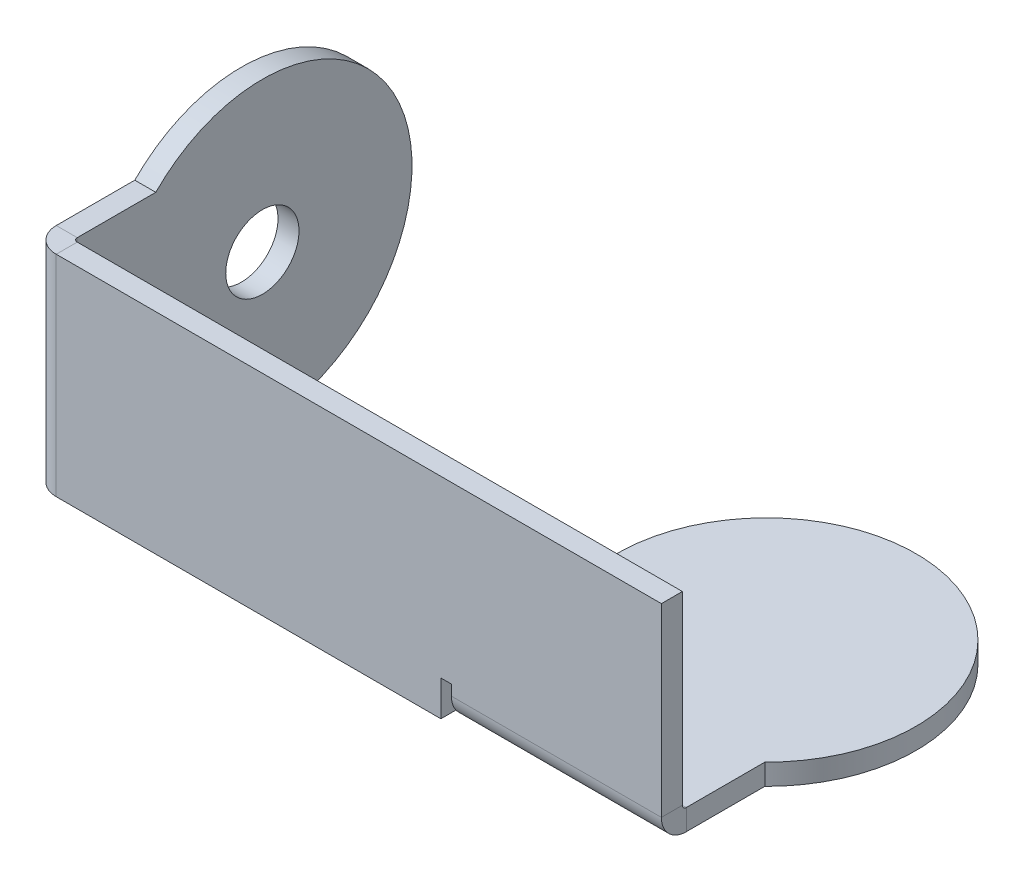
ISO-10303-21;
HEADER;
FILE_DESCRIPTION(('STEP AP214'),'2;1');
FILE_NAME('part.step','',(''),(''),'','','');
FILE_SCHEMA(('AUTOMOTIVE_DESIGN { 1 0 10303 214 1 1 1 1 }'));
ENDSEC;
DATA;
#1=APPLICATION_CONTEXT('core data for automotive mechanical design processes');
#2=APPLICATION_PROTOCOL_DEFINITION('international standard','automotive_design',2000,#1);
#3=PRODUCT_CONTEXT('',#1,'mechanical');
#4=PRODUCT('Part','Part','',(#3));
#5=PRODUCT_RELATED_PRODUCT_CATEGORY('part','',(#4));
#6=PRODUCT_DEFINITION_FORMATION('','',#4);
#7=PRODUCT_DEFINITION_CONTEXT('part definition',#1,'design');
#8=PRODUCT_DEFINITION('design','',#6,#7);
#9=PRODUCT_DEFINITION_SHAPE('','',#8);
#10=(LENGTH_UNIT() NAMED_UNIT(*) SI_UNIT(.MILLI.,.METRE.));
#11=(NAMED_UNIT(*) PLANE_ANGLE_UNIT() SI_UNIT($,.RADIAN.));
#12=(NAMED_UNIT(*) SI_UNIT($,.STERADIAN.) SOLID_ANGLE_UNIT());
#13=UNCERTAINTY_MEASURE_WITH_UNIT(LENGTH_MEASURE(1.E-05),#10,'distance_accuracy_value','');
#14=(GEOMETRIC_REPRESENTATION_CONTEXT(3) GLOBAL_UNCERTAINTY_ASSIGNED_CONTEXT((#13)) GLOBAL_UNIT_ASSIGNED_CONTEXT((#10,
#11,#12)) REPRESENTATION_CONTEXT('',''));
#15=CARTESIAN_POINT('',(0.,0.,0.));
#16=DIRECTION('',(0.,0.,1.));
#17=DIRECTION('',(1.,0.,0.));
#18=AXIS2_PLACEMENT_3D('',#15,#16,#17);
#19=CARTESIAN_POINT('',(0.,0.,-4.));
#20=DIRECTION('',(0.,0.,-1.));
#21=DIRECTION('',(-1.,0.,0.));
#22=AXIS2_PLACEMENT_3D('',#19,#20,#21);
#23=PLANE('',#22);
#24=DIRECTION('',(1.,0.,0.));
#25=VECTOR('',#24,1.);
#26=CARTESIAN_POINT('',(18.,-13.2634,-4.));
#27=LINE('',#26,#25);
#28=CARTESIAN_POINT('',(18.,-13.2634,-4.));
#29=VERTEX_POINT('',#28);
#30=CARTESIAN_POINT('',(20.,-13.2634,-4.));
#31=VERTEX_POINT('',#30);
#32=EDGE_CURVE('E254',#29,#31,#27,.T.);
#33=ORIENTED_EDGE('',*,*,#32,.F.);
#34=DIRECTION('',(0.,1.,0.));
#35=VECTOR('',#34,1.);
#36=CARTESIAN_POINT('',(18.,-20.,-4.));
#37=LINE('',#36,#35);
#38=CARTESIAN_POINT('',(18.,-20.,-4.));
#39=VERTEX_POINT('',#38);
#40=EDGE_CURVE('E249',#39,#29,#37,.T.);
#41=ORIENTED_EDGE('',*,*,#40,.F.);
#42=DIRECTION('',(1.,0.,0.));
#43=VECTOR('',#42,1.);
#44=CARTESIAN_POINT('',(60.,-20.,-4.));
#45=LINE('',#44,#43);
#46=CARTESIAN_POINT('',(-55.2634,-20.,-4.));
#47=VERTEX_POINT('',#46);
#48=EDGE_CURVE('E329',#47,#39,#45,.T.);
#49=ORIENTED_EDGE('',*,*,#48,.F.);
#50=DIRECTION('',(0.,1.,0.));
#51=VECTOR('',#50,1.);
#52=CARTESIAN_POINT('',(-55.2634,20.,-3.99999999999999));
#53=LINE('',#52,#51);
#54=CARTESIAN_POINT('',(-55.2634,20.,-4.));
#55=VERTEX_POINT('',#54);
#56=EDGE_CURVE('E319',#55,#47,#53,.F.);
#57=ORIENTED_EDGE('',*,*,#56,.F.);
#58=DIRECTION('',(-1.,0.,0.));
#59=VECTOR('',#58,1.);
#60=CARTESIAN_POINT('',(60.,20.,-4.));
#61=LINE('',#60,#59);
#62=CARTESIAN_POINT('',(60.,20.,-4.));
#63=VERTEX_POINT('',#62);
#64=EDGE_CURVE('E335',#63,#55,#61,.T.);
#65=ORIENTED_EDGE('',*,*,#64,.F.);
#66=DIRECTION('',(0.,1.,0.));
#67=VECTOR('',#66,1.);
#68=CARTESIAN_POINT('',(60.,20.,-4.));
#69=LINE('',#68,#67);
#70=CARTESIAN_POINT('',(60.,-15.2634,-4.));
#71=VERTEX_POINT('',#70);
#72=EDGE_CURVE('E332',#71,#63,#69,.T.);
#73=ORIENTED_EDGE('',*,*,#72,.F.);
#74=DIRECTION('',(-1.,0.,0.));
#75=VECTOR('',#74,1.);
#76=CARTESIAN_POINT('',(20.,-15.2634,-4.));
#77=LINE('',#76,#75);
#78=CARTESIAN_POINT('',(20.,-15.2634,-4.));
#79=VERTEX_POINT('',#78);
#80=EDGE_CURVE('E239',#79,#71,#77,.F.);
#81=ORIENTED_EDGE('',*,*,#80,.F.);
#82=DIRECTION('',(0.,-1.,0.));
#83=VECTOR('',#82,1.);
#84=CARTESIAN_POINT('',(20.,-13.2634,-4.));
#85=LINE('',#84,#83);
#86=EDGE_CURVE('E258',#31,#79,#85,.T.);
#87=ORIENTED_EDGE('',*,*,#86,.F.);
#88=EDGE_LOOP('',(#33,#41,#49,#57,#65,#73,#81,#87));
#89=FACE_BOUND('',#88,.T.);
#90=ADVANCED_FACE('F81',(#89),#23,.T.);
#91=CARTESIAN_POINT('',(0.,0.,0.));
#92=DIRECTION('',(0.,0.,-1.));
#93=DIRECTION('',(-1.,0.,0.));
#94=AXIS2_PLACEMENT_3D('',#91,#92,#93);
#95=PLANE('',#94);
#96=DIRECTION('',(0.,-1.,0.));
#97=VECTOR('',#96,1.);
#98=CARTESIAN_POINT('',(18.,0.,0.));
#99=LINE('',#98,#97);
#100=CARTESIAN_POINT('',(18.,-13.2634,0.));
#101=VERTEX_POINT('',#100);
#102=CARTESIAN_POINT('',(18.,-20.,0.));
#103=VERTEX_POINT('',#102);
#104=EDGE_CURVE('E252',#101,#103,#99,.T.);
#105=ORIENTED_EDGE('',*,*,#104,.F.);
#106=DIRECTION('',(-1.,0.,0.));
#107=VECTOR('',#106,1.);
#108=CARTESIAN_POINT('',(0.,-13.2634,0.));
#109=LINE('',#108,#107);
#110=CARTESIAN_POINT('',(20.,-13.2634,0.));
#111=VERTEX_POINT('',#110);
#112=EDGE_CURVE('E13',#111,#101,#109,.T.);
#113=ORIENTED_EDGE('',*,*,#112,.F.);
#114=DIRECTION('',(0.,1.,0.));
#115=VECTOR('',#114,1.);
#116=CARTESIAN_POINT('',(20.,0.,0.));
#117=LINE('',#116,#115);
#118=CARTESIAN_POINT('',(20.,-15.2634,0.));
#119=VERTEX_POINT('',#118);
#120=EDGE_CURVE('E89',#119,#111,#117,.T.);
#121=ORIENTED_EDGE('',*,*,#120,.F.);
#122=DIRECTION('',(-1.,0.,0.));
#123=VECTOR('',#122,1.);
#124=CARTESIAN_POINT('',(20.,-15.2634,0.));
#125=LINE('',#124,#123);
#126=CARTESIAN_POINT('',(60.,-15.2634,0.));
#127=VERTEX_POINT('',#126);
#128=EDGE_CURVE('E211',#119,#127,#125,.F.);
#129=ORIENTED_EDGE('',*,*,#128,.T.);
#130=DIRECTION('',(0.,1.,0.));
#131=VECTOR('',#130,1.);
#132=CARTESIAN_POINT('',(60.,20.,0.));
#133=LINE('',#132,#131);
#134=CARTESIAN_POINT('',(60.,20.,0.));
#135=VERTEX_POINT('',#134);
#136=EDGE_CURVE('E341',#127,#135,#133,.T.);
#137=ORIENTED_EDGE('',*,*,#136,.T.);
#138=DIRECTION('',(-1.,0.,0.));
#139=VECTOR('',#138,1.);
#140=CARTESIAN_POINT('',(60.,20.,0.));
#141=LINE('',#140,#139);
#142=CARTESIAN_POINT('',(-55.2634,20.,0.));
#143=VERTEX_POINT('',#142);
#144=EDGE_CURVE('E333',#135,#143,#141,.T.);
#145=ORIENTED_EDGE('',*,*,#144,.T.);
#146=DIRECTION('',(0.,1.,0.));
#147=VECTOR('',#146,1.);
#148=CARTESIAN_POINT('',(-55.2634,20.,0.));
#149=LINE('',#148,#147);
#150=CARTESIAN_POINT('',(-55.2634,-20.,0.));
#151=VERTEX_POINT('',#150);
#152=EDGE_CURVE('E307',#143,#151,#149,.F.);
#153=ORIENTED_EDGE('',*,*,#152,.T.);
#154=DIRECTION('',(1.,0.,0.));
#155=VECTOR('',#154,1.);
#156=CARTESIAN_POINT('',(60.,-20.,0.));
#157=LINE('',#156,#155);
#158=EDGE_CURVE('E327',#151,#103,#157,.T.);
#159=ORIENTED_EDGE('',*,*,#158,.T.);
#160=EDGE_LOOP('',(#105,#113,#121,#129,#137,#145,#153,#159));
#161=FACE_BOUND('',#160,.T.);
#162=ADVANCED_FACE('F355',(#161),#95,.F.);
#163=CARTESIAN_POINT('',(60.,-20.,-4.));
#164=DIRECTION('',(0.,-1.,0.));
#165=DIRECTION('',(1.,0.,0.));
#166=AXIS2_PLACEMENT_3D('',#163,#164,#165);
#167=PLANE('',#166);
#168=ORIENTED_EDGE('',*,*,#48,.T.);
#169=DIRECTION('',(0.,0.,1.));
#170=VECTOR('',#169,1.);
#171=CARTESIAN_POINT('',(18.,-20.,-4.));
#172=LINE('',#171,#170);
#173=EDGE_CURVE('E253',#39,#103,#172,.T.);
#174=ORIENTED_EDGE('',*,*,#173,.T.);
#175=ORIENTED_EDGE('',*,*,#158,.F.);
#176=DIRECTION('',(0.,0.,1.));
#177=VECTOR('',#176,1.);
#178=CARTESIAN_POINT('',(-55.2634,-20.,-3.99999999999999));
#179=LINE('',#178,#177);
#180=EDGE_CURVE('E324',#47,#151,#179,.T.);
#181=ORIENTED_EDGE('',*,*,#180,.F.);
#182=EDGE_LOOP('',(#168,#174,#175,#181));
#183=FACE_BOUND('',#182,.T.);
#184=ADVANCED_FACE('F83',(#183),#167,.T.);
#185=CARTESIAN_POINT('',(60.,20.,-4.));
#186=DIRECTION('',(0.,1.,0.));
#187=DIRECTION('',(-1.,0.,0.));
#188=AXIS2_PLACEMENT_3D('',#185,#186,#187);
#189=PLANE('',#188);
#190=ORIENTED_EDGE('',*,*,#64,.T.);
#191=DIRECTION('',(0.,0.,1.));
#192=VECTOR('',#191,1.);
#193=CARTESIAN_POINT('',(-55.2634,20.,-3.99999999999999));
#194=LINE('',#193,#192);
#195=EDGE_CURVE('E313',#55,#143,#194,.T.);
#196=ORIENTED_EDGE('',*,*,#195,.T.);
#197=ORIENTED_EDGE('',*,*,#144,.F.);
#198=DIRECTION('',(0.,0.,1.));
#199=VECTOR('',#198,1.);
#200=CARTESIAN_POINT('',(60.,20.,-4.));
#201=LINE('',#200,#199);
#202=EDGE_CURVE('E338',#63,#135,#201,.T.);
#203=ORIENTED_EDGE('',*,*,#202,.F.);
#204=EDGE_LOOP('',(#190,#196,#197,#203));
#205=FACE_BOUND('',#204,.T.);
#206=ADVANCED_FACE('F399',(#205),#189,.T.);
#207=CARTESIAN_POINT('',(60.,20.,-4.));
#208=DIRECTION('',(1.,0.,0.));
#209=DIRECTION('',(0.,1.,0.));
#210=AXIS2_PLACEMENT_3D('',#207,#208,#209);
#211=PLANE('',#210);
#212=DIRECTION('',(0.,0.,1.));
#213=VECTOR('',#212,1.);
#214=CARTESIAN_POINT('',(60.,-15.2634,-4.));
#215=LINE('',#214,#213);
#216=EDGE_CURVE('E243',#71,#127,#215,.T.);
#217=ORIENTED_EDGE('',*,*,#216,.F.);
#218=ORIENTED_EDGE('',*,*,#72,.T.);
#219=ORIENTED_EDGE('',*,*,#202,.T.);
#220=ORIENTED_EDGE('',*,*,#136,.F.);
#221=EDGE_LOOP('',(#217,#218,#219,#220));
#222=FACE_BOUND('',#221,.T.);
#223=ADVANCED_FACE('F443',(#222),#211,.T.);
#224=CARTESIAN_POINT('',(-55.2634,-20.,-4.7366));
#225=DIRECTION('',(0.,-1.,0.));
#226=DIRECTION('',(0.,0.,-1.));
#227=AXIS2_PLACEMENT_3D('',#224,#225,#226);
#228=PLANE('',#227);
#229=DIRECTION('',(-1.,0.,0.));
#230=VECTOR('',#229,1.);
#231=CARTESIAN_POINT('',(-60.,-20.,-4.73659999999998));
#232=LINE('',#231,#230);
#233=CARTESIAN_POINT('',(-56.,-20.,-4.73659999999999));
#234=VERTEX_POINT('',#233);
#235=CARTESIAN_POINT('',(-60.,-20.,-4.73659999999998));
#236=VERTEX_POINT('',#235);
#237=EDGE_CURVE('E285',#234,#236,#232,.T.);
#238=ORIENTED_EDGE('',*,*,#237,.F.);
#239=CARTESIAN_POINT('',(-55.2634,-20.,-4.7366));
#240=DIRECTION('',(0.,1.,0.));
#241=DIRECTION('',(0.,0.,1.));
#242=AXIS2_PLACEMENT_3D('',#239,#240,#241);
#243=CIRCLE('',#242,0.736600000000004);
#244=EDGE_CURVE('E316',#47,#234,#243,.F.);
#245=ORIENTED_EDGE('',*,*,#244,.F.);
#246=ORIENTED_EDGE('',*,*,#180,.T.);
#247=CARTESIAN_POINT('',(-55.2634,-20.,-4.7366));
#248=DIRECTION('',(0.,1.,0.));
#249=DIRECTION('',(0.,0.,1.));
#250=AXIS2_PLACEMENT_3D('',#247,#248,#249);
#251=CIRCLE('',#250,4.7366);
#252=EDGE_CURVE('E309',#151,#236,#251,.F.);
#253=ORIENTED_EDGE('',*,*,#252,.T.);
#254=EDGE_LOOP('',(#238,#245,#246,#253));
#255=FACE_BOUND('',#254,.T.);
#256=ADVANCED_FACE('F370',(#255),#228,.T.);
#257=CARTESIAN_POINT('',(-55.2634,20.,-4.7366));
#258=DIRECTION('',(0.,-1.,0.));
#259=DIRECTION('',(0.,0.,-1.));
#260=AXIS2_PLACEMENT_3D('',#257,#258,#259);
#261=PLANE('',#260);
#262=CARTESIAN_POINT('',(-55.2634,20.,-4.7366));
#263=DIRECTION('',(0.,1.,0.));
#264=DIRECTION('',(0.,0.,1.));
#265=AXIS2_PLACEMENT_3D('',#262,#263,#264);
#266=CIRCLE('',#265,0.736600000000004);
#267=CARTESIAN_POINT('',(-56.,20.,-4.73659999999999));
#268=VERTEX_POINT('',#267);
#269=EDGE_CURVE('E288',#268,#55,#266,.T.);
#270=ORIENTED_EDGE('',*,*,#269,.F.);
#271=DIRECTION('',(-1.,0.,0.));
#272=VECTOR('',#271,1.);
#273=CARTESIAN_POINT('',(-56.,20.,-4.73659999999999));
#274=LINE('',#273,#272);
#275=CARTESIAN_POINT('',(-60.,20.,-4.73659999999998));
#276=VERTEX_POINT('',#275);
#277=EDGE_CURVE('E299',#268,#276,#274,.T.);
#278=ORIENTED_EDGE('',*,*,#277,.T.);
#279=CARTESIAN_POINT('',(-55.2634,20.,-4.7366));
#280=DIRECTION('',(0.,1.,0.));
#281=DIRECTION('',(0.,0.,1.));
#282=AXIS2_PLACEMENT_3D('',#279,#280,#281);
#283=CIRCLE('',#282,4.7366);
#284=EDGE_CURVE('E310',#276,#143,#283,.T.);
#285=ORIENTED_EDGE('',*,*,#284,.T.);
#286=ORIENTED_EDGE('',*,*,#195,.F.);
#287=EDGE_LOOP('',(#270,#278,#285,#286));
#288=FACE_BOUND('',#287,.T.);
#289=ADVANCED_FACE('F388',(#288),#261,.F.);
#290=CARTESIAN_POINT('',(-55.2634,20.,-4.7366));
#291=DIRECTION('',(0.,1.,0.));
#292=DIRECTION('',(-1.,0.,0.));
#293=AXIS2_PLACEMENT_3D('',#290,#291,#292);
#294=CYLINDRICAL_SURFACE('',#293,4.7366);
#295=ORIENTED_EDGE('',*,*,#152,.F.);
#296=ORIENTED_EDGE('',*,*,#284,.F.);
#297=DIRECTION('',(0.,1.,0.));
#298=VECTOR('',#297,1.);
#299=CARTESIAN_POINT('',(-60.,0.,-4.73659999999998));
#300=LINE('',#299,#298);
#301=EDGE_CURVE('E296',#236,#276,#300,.T.);
#302=ORIENTED_EDGE('',*,*,#301,.F.);
#303=ORIENTED_EDGE('',*,*,#252,.F.);
#304=EDGE_LOOP('',(#295,#296,#302,#303));
#305=FACE_BOUND('',#304,.T.);
#306=ADVANCED_FACE('F394',(#305),#294,.T.);
#307=CARTESIAN_POINT('',(-55.2634,20.,-4.7366));
#308=DIRECTION('',(0.,1.,0.));
#309=DIRECTION('',(-1.,0.,0.));
#310=AXIS2_PLACEMENT_3D('',#307,#308,#309);
#311=CYLINDRICAL_SURFACE('',#310,0.736600000000004);
#312=ORIENTED_EDGE('',*,*,#56,.T.);
#313=ORIENTED_EDGE('',*,*,#244,.T.);
#314=DIRECTION('',(0.,-1.,0.));
#315=VECTOR('',#314,1.);
#316=CARTESIAN_POINT('',(-56.,-20.,-4.73659999999999));
#317=LINE('',#316,#315);
#318=EDGE_CURVE('E302',#234,#268,#317,.F.);
#319=ORIENTED_EDGE('',*,*,#318,.T.);
#320=ORIENTED_EDGE('',*,*,#269,.T.);
#321=EDGE_LOOP('',(#312,#313,#319,#320));
#322=FACE_BOUND('',#321,.T.);
#323=ADVANCED_FACE('F366',(#322),#311,.F.);
#324=CARTESIAN_POINT('',(-60.,20.,-3.99999999999999));
#325=DIRECTION('',(0.,1.,0.));
#326=DIRECTION('',(0.,0.,1.));
#327=AXIS2_PLACEMENT_3D('',#324,#325,#326);
#328=PLANE('',#327);
#329=DIRECTION('',(-1.,0.,0.));
#330=VECTOR('',#329,1.);
#331=CARTESIAN_POINT('',(-56.,20.,-19.6960594957529));
#332=LINE('',#331,#330);
#333=CARTESIAN_POINT('',(-60.0000000000001,20.,-19.6960594957528));
#334=VERTEX_POINT('',#333);
#335=CARTESIAN_POINT('',(-56.0000000000001,20.,-19.6960594957529));
#336=VERTEX_POINT('',#335);
#337=EDGE_CURVE('E282',#334,#336,#332,.F.);
#338=ORIENTED_EDGE('',*,*,#337,.F.);
#339=DIRECTION('',(0.,0.,1.));
#340=VECTOR('',#339,1.);
#341=CARTESIAN_POINT('',(-60.,20.,-3.99999999999999));
#342=LINE('',#341,#340);
#343=EDGE_CURVE('E286',#334,#276,#342,.T.);
#344=ORIENTED_EDGE('',*,*,#343,.T.);
#345=ORIENTED_EDGE('',*,*,#277,.F.);
#346=DIRECTION('',(0.,0.,-1.));
#347=VECTOR('',#346,1.);
#348=CARTESIAN_POINT('',(-56.,20.,2.08166817117217E-13));
#349=LINE('',#348,#347);
#350=EDGE_CURVE('E291',#336,#268,#349,.F.);
#351=ORIENTED_EDGE('',*,*,#350,.F.);
#352=EDGE_LOOP('',(#338,#344,#345,#351));
#353=FACE_BOUND('',#352,.T.);
#354=ADVANCED_FACE('F390',(#353),#328,.T.);
#355=CARTESIAN_POINT('',(-60.0000000000001,-20.,-36.));
#356=DIRECTION('',(0.,-1.,0.));
#357=DIRECTION('',(0.,0.,-1.));
#358=AXIS2_PLACEMENT_3D('',#355,#356,#357);
#359=PLANE('',#358);
#360=DIRECTION('',(-1.,0.,0.));
#361=VECTOR('',#360,1.);
#362=CARTESIAN_POINT('',(-56.,-20.,-19.6960594957529));
#363=LINE('',#362,#361);
#364=CARTESIAN_POINT('',(-56.0000000000001,-20.,-19.6960594957529));
#365=VERTEX_POINT('',#364);
#366=CARTESIAN_POINT('',(-60.0000000000001,-20.,-19.6960594957528));
#367=VERTEX_POINT('',#366);
#368=EDGE_CURVE('E277',#365,#367,#363,.T.);
#369=ORIENTED_EDGE('',*,*,#368,.F.);
#370=DIRECTION('',(0.,0.,1.));
#371=VECTOR('',#370,1.);
#372=CARTESIAN_POINT('',(-56.,-20.,2.08166817117217E-13));
#373=LINE('',#372,#371);
#374=EDGE_CURVE('E293',#234,#365,#373,.F.);
#375=ORIENTED_EDGE('',*,*,#374,.F.);
#376=ORIENTED_EDGE('',*,*,#237,.T.);
#377=DIRECTION('',(0.,0.,-1.));
#378=VECTOR('',#377,1.);
#379=CARTESIAN_POINT('',(-60.0000000000001,-20.,-36.));
#380=LINE('',#379,#378);
#381=EDGE_CURVE('E289',#236,#367,#380,.T.);
#382=ORIENTED_EDGE('',*,*,#381,.T.);
#383=EDGE_LOOP('',(#369,#375,#376,#382));
#384=FACE_BOUND('',#383,.T.);
#385=ADVANCED_FACE('F375',(#384),#359,.T.);
#386=CARTESIAN_POINT('',(-60.,0.,2.22132742472589E-13));
#387=DIRECTION('',(-1.,0.,0.));
#388=DIRECTION('',(0.,0.,1.));
#389=AXIS2_PLACEMENT_3D('',#386,#387,#388);
#390=PLANE('',#389);
#391=CARTESIAN_POINT('',(-60.0000000000001,0.,-39.9999999999998));
#392=DIRECTION('',(-1.,0.,0.));
#393=DIRECTION('',(0.,0.,1.));
#394=AXIS2_PLACEMENT_3D('',#391,#392,#393);
#395=CIRCLE('',#394,6.97976734515319);
#396=CARTESIAN_POINT('',(-60.0000000000001,0.,-33.0202326548466));
#397=VERTEX_POINT('',#396);
#398=EDGE_CURVE('E267',#397,#397,#395,.T.);
#399=ORIENTED_EDGE('',*,*,#398,.F.);
#400=EDGE_LOOP('',(#399));
#401=FACE_BOUND('',#400,.T.);
#402=ORIENTED_EDGE('',*,*,#343,.F.);
#403=CARTESIAN_POINT('',(-60.0000000000001,0.,-39.9999999999998));
#404=DIRECTION('',(-1.,0.,0.));
#405=DIRECTION('',(0.,0.,1.));
#406=AXIS2_PLACEMENT_3D('',#403,#404,#405);
#407=CIRCLE('',#406,28.5);
#408=EDGE_CURVE('E271',#334,#367,#407,.T.);
#409=ORIENTED_EDGE('',*,*,#408,.T.);
#410=ORIENTED_EDGE('',*,*,#381,.F.);
#411=ORIENTED_EDGE('',*,*,#301,.T.);
#412=EDGE_LOOP('',(#402,#409,#410,#411));
#413=FACE_BOUND('',#412,.T.);
#414=ADVANCED_FACE('F378',(#401,#413),#390,.T.);
#415=CARTESIAN_POINT('',(-56.,0.,2.08166817117217E-13));
#416=DIRECTION('',(-1.,0.,0.));
#417=DIRECTION('',(0.,0.,1.));
#418=AXIS2_PLACEMENT_3D('',#415,#416,#417);
#419=PLANE('',#418);
#420=CARTESIAN_POINT('',(-56.0000000000001,0.,-39.9999999999998));
#421=DIRECTION('',(-1.,0.,0.));
#422=DIRECTION('',(0.,0.,1.));
#423=AXIS2_PLACEMENT_3D('',#420,#421,#422);
#424=CIRCLE('',#423,6.97976734515319);
#425=CARTESIAN_POINT('',(-56.0000000000001,0.,-33.0202326548466));
#426=VERTEX_POINT('',#425);
#427=EDGE_CURVE('E268',#426,#426,#424,.T.);
#428=ORIENTED_EDGE('',*,*,#427,.T.);
#429=EDGE_LOOP('',(#428));
#430=FACE_BOUND('',#429,.T.);
#431=CARTESIAN_POINT('',(-56.0000000000001,0.,-39.9999999999998));
#432=DIRECTION('',(-1.,0.,0.));
#433=DIRECTION('',(0.,0.,1.));
#434=AXIS2_PLACEMENT_3D('',#431,#432,#433);
#435=CIRCLE('',#434,28.5);
#436=EDGE_CURVE('E274',#336,#365,#435,.T.);
#437=ORIENTED_EDGE('',*,*,#436,.F.);
#438=ORIENTED_EDGE('',*,*,#350,.T.);
#439=ORIENTED_EDGE('',*,*,#318,.F.);
#440=ORIENTED_EDGE('',*,*,#374,.T.);
#441=EDGE_LOOP('',(#437,#438,#439,#440));
#442=FACE_BOUND('',#441,.T.);
#443=ADVANCED_FACE('F384',(#430,#442),#419,.F.);
#444=CARTESIAN_POINT('',(-56.0000000000001,0.,-39.9999999999998));
#445=DIRECTION('',(-1.,0.,0.));
#446=DIRECTION('',(0.,0.,1.));
#447=AXIS2_PLACEMENT_3D('',#444,#445,#446);
#448=CYLINDRICAL_SURFACE('',#447,28.5);
#449=ORIENTED_EDGE('',*,*,#408,.F.);
#450=ORIENTED_EDGE('',*,*,#337,.T.);
#451=ORIENTED_EDGE('',*,*,#436,.T.);
#452=ORIENTED_EDGE('',*,*,#368,.T.);
#453=EDGE_LOOP('',(#449,#450,#451,#452));
#454=FACE_BOUND('',#453,.T.);
#455=ADVANCED_FACE('F381',(#454),#448,.T.);
#456=CARTESIAN_POINT('',(-56.0000000000001,0.,-39.9999999999998));
#457=DIRECTION('',(-1.,0.,0.));
#458=DIRECTION('',(0.,0.,1.));
#459=AXIS2_PLACEMENT_3D('',#456,#457,#458);
#460=CYLINDRICAL_SURFACE('',#459,6.97976734515319);
#461=ORIENTED_EDGE('',*,*,#427,.F.);
#462=EDGE_LOOP('',(#461));
#463=FACE_BOUND('',#462,.T.);
#464=ORIENTED_EDGE('',*,*,#398,.T.);
#465=EDGE_LOOP('',(#464));
#466=FACE_BOUND('',#465,.T.);
#467=ADVANCED_FACE('F470',(#463,#466),#460,.F.);
#468=CARTESIAN_POINT('',(18.,-13.2634,-4.));
#469=DIRECTION('',(0.,-1.,0.));
#470=DIRECTION('',(0.,0.,-1.));
#471=AXIS2_PLACEMENT_3D('',#468,#469,#470);
#472=PLANE('',#471);
#473=DIRECTION('',(0.,0.,1.));
#474=VECTOR('',#473,1.);
#475=CARTESIAN_POINT('',(20.,-13.2634,-4.));
#476=LINE('',#475,#474);
#477=EDGE_CURVE('E246',#31,#111,#476,.T.);
#478=ORIENTED_EDGE('',*,*,#477,.T.);
#479=ORIENTED_EDGE('',*,*,#112,.T.);
#480=DIRECTION('',(0.,0.,1.));
#481=VECTOR('',#480,1.);
#482=CARTESIAN_POINT('',(18.,-13.2634,-4.));
#483=LINE('',#482,#481);
#484=EDGE_CURVE('E257',#29,#101,#483,.T.);
#485=ORIENTED_EDGE('',*,*,#484,.F.);
#486=ORIENTED_EDGE('',*,*,#32,.T.);
#487=EDGE_LOOP('',(#478,#479,#485,#486));
#488=FACE_BOUND('',#487,.T.);
#489=ADVANCED_FACE('F351',(#488),#472,.T.);
#490=CARTESIAN_POINT('',(20.,-13.2634,-4.));
#491=DIRECTION('',(-1.,0.,0.));
#492=DIRECTION('',(0.,0.,1.));
#493=AXIS2_PLACEMENT_3D('',#490,#491,#492);
#494=PLANE('',#493);
#495=DIRECTION('',(0.,0.,1.));
#496=VECTOR('',#495,1.);
#497=CARTESIAN_POINT('',(20.,-15.2634,-4.));
#498=LINE('',#497,#496);
#499=EDGE_CURVE('E235',#79,#119,#498,.T.);
#500=ORIENTED_EDGE('',*,*,#499,.T.);
#501=ORIENTED_EDGE('',*,*,#120,.T.);
#502=ORIENTED_EDGE('',*,*,#477,.F.);
#503=ORIENTED_EDGE('',*,*,#86,.T.);
#504=EDGE_LOOP('',(#500,#501,#502,#503));
#505=FACE_BOUND('',#504,.T.);
#506=ADVANCED_FACE('F347',(#505),#494,.T.);
#507=CARTESIAN_POINT('',(18.,-20.,-4.));
#508=DIRECTION('',(1.,0.,0.));
#509=DIRECTION('',(0.,1.,0.));
#510=AXIS2_PLACEMENT_3D('',#507,#508,#509);
#511=PLANE('',#510);
#512=ORIENTED_EDGE('',*,*,#484,.T.);
#513=ORIENTED_EDGE('',*,*,#104,.T.);
#514=ORIENTED_EDGE('',*,*,#173,.F.);
#515=ORIENTED_EDGE('',*,*,#40,.T.);
#516=EDGE_LOOP('',(#512,#513,#514,#515));
#517=FACE_BOUND('',#516,.T.);
#518=ADVANCED_FACE('F358',(#517),#511,.T.);
#519=CARTESIAN_POINT('',(60.,-15.2634,-4.7366));
#520=DIRECTION('',(1.,0.,0.));
#521=DIRECTION('',(0.,0.,-1.));
#522=AXIS2_PLACEMENT_3D('',#519,#520,#521);
#523=PLANE('',#522);
#524=DIRECTION('',(0.,-1.,0.));
#525=VECTOR('',#524,1.);
#526=CARTESIAN_POINT('',(60.,-20.,-4.73659999999998));
#527=LINE('',#526,#525);
#528=CARTESIAN_POINT('',(60.,-16.,-4.7366));
#529=VERTEX_POINT('',#528);
#530=CARTESIAN_POINT('',(60.,-20.,-4.73659999999998));
#531=VERTEX_POINT('',#530);
#532=EDGE_CURVE('E231',#529,#531,#527,.T.);
#533=ORIENTED_EDGE('',*,*,#532,.F.);
#534=CARTESIAN_POINT('',(60.,-15.2634,-4.7366));
#535=DIRECTION('',(-1.,0.,0.));
#536=DIRECTION('',(0.,0.,1.));
#537=AXIS2_PLACEMENT_3D('',#534,#535,#536);
#538=CIRCLE('',#537,0.736599999999997);
#539=EDGE_CURVE('E214',#71,#529,#538,.F.);
#540=ORIENTED_EDGE('',*,*,#539,.F.);
#541=ORIENTED_EDGE('',*,*,#216,.T.);
#542=CARTESIAN_POINT('',(60.,-15.2634,-4.7366));
#543=DIRECTION('',(-1.,0.,0.));
#544=DIRECTION('',(0.,0.,1.));
#545=AXIS2_PLACEMENT_3D('',#542,#543,#544);
#546=CIRCLE('',#545,4.7366);
#547=EDGE_CURVE('E234',#127,#531,#546,.F.);
#548=ORIENTED_EDGE('',*,*,#547,.T.);
#549=EDGE_LOOP('',(#533,#540,#541,#548));
#550=FACE_BOUND('',#549,.T.);
#551=ADVANCED_FACE('F408',(#550),#523,.T.);
#552=CARTESIAN_POINT('',(20.,-15.2634,-4.7366));
#553=DIRECTION('',(1.,0.,0.));
#554=DIRECTION('',(0.,0.,-1.));
#555=AXIS2_PLACEMENT_3D('',#552,#553,#554);
#556=PLANE('',#555);
#557=CARTESIAN_POINT('',(20.,-15.2634,-4.7366));
#558=DIRECTION('',(-1.,0.,0.));
#559=DIRECTION('',(0.,0.,1.));
#560=AXIS2_PLACEMENT_3D('',#557,#558,#559);
#561=CIRCLE('',#560,0.736599999999997);
#562=CARTESIAN_POINT('',(20.,-16.,-4.7366));
#563=VERTEX_POINT('',#562);
#564=EDGE_CURVE('E201',#563,#79,#561,.T.);
#565=ORIENTED_EDGE('',*,*,#564,.F.);
#566=DIRECTION('',(0.,-1.,0.));
#567=VECTOR('',#566,1.);
#568=CARTESIAN_POINT('',(20.,-16.,-4.73659999999999));
#569=LINE('',#568,#567);
#570=CARTESIAN_POINT('',(20.,-20.,-4.73659999999998));
#571=VERTEX_POINT('',#570);
#572=EDGE_CURVE('E196',#563,#571,#569,.T.);
#573=ORIENTED_EDGE('',*,*,#572,.T.);
#574=CARTESIAN_POINT('',(20.,-15.2634,-4.7366));
#575=DIRECTION('',(-1.,0.,0.));
#576=DIRECTION('',(0.,0.,1.));
#577=AXIS2_PLACEMENT_3D('',#574,#575,#576);
#578=CIRCLE('',#577,4.7366);
#579=EDGE_CURVE('E206',#571,#119,#578,.T.);
#580=ORIENTED_EDGE('',*,*,#579,.T.);
#581=ORIENTED_EDGE('',*,*,#499,.F.);
#582=EDGE_LOOP('',(#565,#573,#580,#581));
#583=FACE_BOUND('',#582,.T.);
#584=ADVANCED_FACE('F217',(#583),#556,.F.);
#585=CARTESIAN_POINT('',(20.,-15.2634,-4.7366));
#586=DIRECTION('',(-1.,0.,0.));
#587=DIRECTION('',(0.,-1.,0.));
#588=AXIS2_PLACEMENT_3D('',#585,#586,#587);
#589=CYLINDRICAL_SURFACE('',#588,4.7366);
#590=ORIENTED_EDGE('',*,*,#128,.F.);
#591=ORIENTED_EDGE('',*,*,#579,.F.);
#592=DIRECTION('',(-1.,0.,0.));
#593=VECTOR('',#592,1.);
#594=CARTESIAN_POINT('',(0.,-20.,-4.73659999999998));
#595=LINE('',#594,#593);
#596=EDGE_CURVE('E209',#531,#571,#595,.T.);
#597=ORIENTED_EDGE('',*,*,#596,.F.);
#598=ORIENTED_EDGE('',*,*,#547,.F.);
#599=EDGE_LOOP('',(#590,#591,#597,#598));
#600=FACE_BOUND('',#599,.T.);
#601=ADVANCED_FACE('F207',(#600),#589,.T.);
#602=CARTESIAN_POINT('',(20.,-15.2634,-4.7366));
#603=DIRECTION('',(-1.,0.,0.));
#604=DIRECTION('',(0.,-1.,0.));
#605=AXIS2_PLACEMENT_3D('',#602,#603,#604);
#606=CYLINDRICAL_SURFACE('',#605,0.736599999999997);
#607=ORIENTED_EDGE('',*,*,#80,.T.);
#608=ORIENTED_EDGE('',*,*,#539,.T.);
#609=DIRECTION('',(1.,0.,0.));
#610=VECTOR('',#609,1.);
#611=CARTESIAN_POINT('',(60.,-16.,-4.7366));
#612=LINE('',#611,#610);
#613=EDGE_CURVE('E219',#529,#563,#612,.F.);
#614=ORIENTED_EDGE('',*,*,#613,.T.);
#615=ORIENTED_EDGE('',*,*,#564,.T.);
#616=EDGE_LOOP('',(#607,#608,#614,#615));
#617=FACE_BOUND('',#616,.T.);
#618=ADVANCED_FACE('F405',(#617),#606,.F.);
#619=CARTESIAN_POINT('',(20.,-20.,-3.99999999999999));
#620=DIRECTION('',(-1.,0.,0.));
#621=DIRECTION('',(0.,-1.,0.));
#622=AXIS2_PLACEMENT_3D('',#619,#620,#621);
#623=PLANE('',#622);
#624=DIRECTION('',(0.,-1.,0.));
#625=VECTOR('',#624,1.);
#626=CARTESIAN_POINT('',(20.,-16.0000000000001,-19.6960594957531));
#627=LINE('',#626,#625);
#628=CARTESIAN_POINT('',(20.,-20.0000000000001,-19.6960594957531));
#629=VERTEX_POINT('',#628);
#630=CARTESIAN_POINT('',(20.,-16.0000000000001,-19.6960594957531));
#631=VERTEX_POINT('',#630);
#632=EDGE_CURVE('E96',#629,#631,#627,.F.);
#633=ORIENTED_EDGE('',*,*,#632,.F.);
#634=DIRECTION('',(0.,0.,1.));
#635=VECTOR('',#634,1.);
#636=CARTESIAN_POINT('',(20.,-20.,-3.99999999999999));
#637=LINE('',#636,#635);
#638=EDGE_CURVE('E192',#629,#571,#637,.T.);
#639=ORIENTED_EDGE('',*,*,#638,.T.);
#640=ORIENTED_EDGE('',*,*,#572,.F.);
#641=DIRECTION('',(0.,0.,-1.));
#642=VECTOR('',#641,1.);
#643=CARTESIAN_POINT('',(20.,-16.,0.));
#644=LINE('',#643,#642);
#645=EDGE_CURVE('E225',#631,#563,#644,.F.);
#646=ORIENTED_EDGE('',*,*,#645,.F.);
#647=EDGE_LOOP('',(#633,#639,#640,#646));
#648=FACE_BOUND('',#647,.T.);
#649=ADVANCED_FACE('F194',(#648),#623,.T.);
#650=CARTESIAN_POINT('',(60.,-20.0000000000001,-34.));
#651=DIRECTION('',(1.,0.,0.));
#652=DIRECTION('',(0.,0.,-1.));
#653=AXIS2_PLACEMENT_3D('',#650,#651,#652);
#654=PLANE('',#653);
#655=DIRECTION('',(0.,-1.,0.));
#656=VECTOR('',#655,1.);
#657=CARTESIAN_POINT('',(60.,-16.,-19.696059495753));
#658=LINE('',#657,#656);
#659=CARTESIAN_POINT('',(60.,-16.,-19.696059495753));
#660=VERTEX_POINT('',#659);
#661=CARTESIAN_POINT('',(60.,-20.,-19.696059495753));
#662=VERTEX_POINT('',#661);
#663=EDGE_CURVE('E411',#660,#662,#658,.T.);
#664=ORIENTED_EDGE('',*,*,#663,.F.);
#665=DIRECTION('',(0.,0.,1.));
#666=VECTOR('',#665,1.);
#667=CARTESIAN_POINT('',(60.,-16.,0.));
#668=LINE('',#667,#666);
#669=EDGE_CURVE('E222',#529,#660,#668,.F.);
#670=ORIENTED_EDGE('',*,*,#669,.F.);
#671=ORIENTED_EDGE('',*,*,#532,.T.);
#672=DIRECTION('',(0.,0.,-1.));
#673=VECTOR('',#672,1.);
#674=CARTESIAN_POINT('',(60.,-20.0000000000001,-34.));
#675=LINE('',#674,#673);
#676=EDGE_CURVE('E104',#531,#662,#675,.T.);
#677=ORIENTED_EDGE('',*,*,#676,.T.);
#678=EDGE_LOOP('',(#664,#670,#671,#677));
#679=FACE_BOUND('',#678,.T.);
#680=ADVANCED_FACE('F410',(#679),#654,.T.);
#681=CARTESIAN_POINT('',(0.,-20.,0.));
#682=DIRECTION('',(0.,-1.,0.));
#683=DIRECTION('',(0.,0.,-1.));
#684=AXIS2_PLACEMENT_3D('',#681,#682,#683);
#685=PLANE('',#684);
#686=ORIENTED_EDGE('',*,*,#638,.F.);
#687=CARTESIAN_POINT('',(40.,-20.0000000000001,-40.));
#688=DIRECTION('',(0.,-1.,0.));
#689=DIRECTION('',(0.,0.,-1.));
#690=AXIS2_PLACEMENT_3D('',#687,#688,#689);
#691=CIRCLE('',#690,28.5);
#692=EDGE_CURVE('E419',#629,#662,#691,.T.);
#693=ORIENTED_EDGE('',*,*,#692,.T.);
#694=ORIENTED_EDGE('',*,*,#676,.F.);
#695=ORIENTED_EDGE('',*,*,#596,.T.);
#696=EDGE_LOOP('',(#686,#693,#694,#695));
#697=FACE_BOUND('',#696,.T.);
#698=ADVANCED_FACE('F221',(#697),#685,.T.);
#699=CARTESIAN_POINT('',(0.,-16.,0.));
#700=DIRECTION('',(0.,-1.,0.));
#701=DIRECTION('',(0.,0.,-1.));
#702=AXIS2_PLACEMENT_3D('',#699,#700,#701);
#703=PLANE('',#702);
#704=CARTESIAN_POINT('',(40.,-16.0000000000001,-40.));
#705=DIRECTION('',(0.,-1.,0.));
#706=DIRECTION('',(0.,0.,-1.));
#707=AXIS2_PLACEMENT_3D('',#704,#705,#706);
#708=CIRCLE('',#707,28.5);
#709=EDGE_CURVE('E416',#631,#660,#708,.T.);
#710=ORIENTED_EDGE('',*,*,#709,.F.);
#711=ORIENTED_EDGE('',*,*,#645,.T.);
#712=ORIENTED_EDGE('',*,*,#613,.F.);
#713=ORIENTED_EDGE('',*,*,#669,.T.);
#714=EDGE_LOOP('',(#710,#711,#712,#713));
#715=FACE_BOUND('',#714,.T.);
#716=ADVANCED_FACE('F415',(#715),#703,.F.);
#717=CARTESIAN_POINT('',(40.,-16.0000000000001,-40.));
#718=DIRECTION('',(0.,-1.,0.));
#719=DIRECTION('',(0.,0.,-1.));
#720=AXIS2_PLACEMENT_3D('',#717,#718,#719);
#721=CYLINDRICAL_SURFACE('',#720,28.5);
#722=ORIENTED_EDGE('',*,*,#692,.F.);
#723=ORIENTED_EDGE('',*,*,#632,.T.);
#724=ORIENTED_EDGE('',*,*,#709,.T.);
#725=ORIENTED_EDGE('',*,*,#663,.T.);
#726=EDGE_LOOP('',(#722,#723,#724,#725));
#727=FACE_BOUND('',#726,.T.);
#728=ADVANCED_FACE('F418',(#727),#721,.T.);
#729=CLOSED_SHELL('',(#90,#162,#184,#206,#223,#256,#289,#306,#323,#354,#385,#414,#443,#455,#467,
#489,#506,#518,#551,#584,#601,#618,#649,#680,#698,#716,#728));
#730=MANIFOLD_SOLID_BREP('B2',#729);
#731=ADVANCED_BREP_SHAPE_REPRESENTATION('',(#18,#730),#14);
#732=SHAPE_DEFINITION_REPRESENTATION(#9,#731);
ENDSEC;
END-ISO-10303-21;
